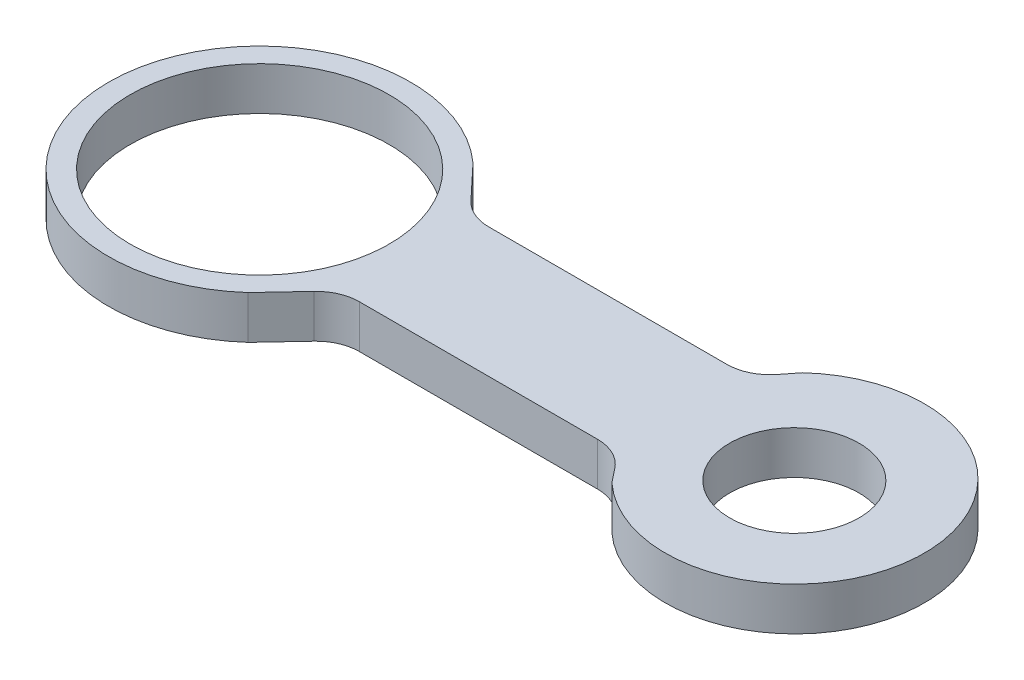
ISO-10303-21;
HEADER;
FILE_DESCRIPTION(('STEP AP214'),'2;1');
FILE_NAME('part.step','',(''),(''),'','','');
FILE_SCHEMA(('AUTOMOTIVE_DESIGN { 1 0 10303 214 1 1 1 1 }'));
ENDSEC;
DATA;
#1=APPLICATION_CONTEXT('core data for automotive mechanical design processes');
#2=APPLICATION_PROTOCOL_DEFINITION('international standard','automotive_design',2000,#1);
#3=PRODUCT_CONTEXT('',#1,'mechanical');
#4=PRODUCT('Part','Part','',(#3));
#5=PRODUCT_RELATED_PRODUCT_CATEGORY('part','',(#4));
#6=PRODUCT_DEFINITION_FORMATION('','',#4);
#7=PRODUCT_DEFINITION_CONTEXT('part definition',#1,'design');
#8=PRODUCT_DEFINITION('design','',#6,#7);
#9=PRODUCT_DEFINITION_SHAPE('','',#8);
#10=(LENGTH_UNIT() NAMED_UNIT(*) SI_UNIT(.MILLI.,.METRE.));
#11=(NAMED_UNIT(*) PLANE_ANGLE_UNIT() SI_UNIT($,.RADIAN.));
#12=(NAMED_UNIT(*) SI_UNIT($,.STERADIAN.) SOLID_ANGLE_UNIT());
#13=UNCERTAINTY_MEASURE_WITH_UNIT(LENGTH_MEASURE(1.E-05),#10,'distance_accuracy_value','');
#14=(GEOMETRIC_REPRESENTATION_CONTEXT(3) GLOBAL_UNCERTAINTY_ASSIGNED_CONTEXT((#13)) GLOBAL_UNIT_ASSIGNED_CONTEXT((#10,
#11,#12)) REPRESENTATION_CONTEXT('',''));
#15=CARTESIAN_POINT('',(0.,0.,0.));
#16=DIRECTION('',(0.,0.,1.));
#17=DIRECTION('',(1.,0.,0.));
#18=AXIS2_PLACEMENT_3D('',#15,#16,#17);
#19=CARTESIAN_POINT('',(34.5542588042572,10.,29.2896186462432));
#20=DIRECTION('',(0.,1.,0.));
#21=DIRECTION('',(0.,0.,1.));
#22=AXIS2_PLACEMENT_3D('',#19,#20,#21);
#23=PLANE('',#22);
#24=CARTESIAN_POINT('',(-58.6855285069248,10.,4.28961864624318));
#25=DIRECTION('',(0.,1.,0.));
#26=DIRECTION('',(0.,0.,1.));
#27=AXIS2_PLACEMENT_3D('',#24,#25,#26);
#28=CIRCLE('',#27,30.);
#29=CARTESIAN_POINT('',(-58.6855285069248,10.,34.2896186462432));
#30=VERTEX_POINT('',#29);
#31=EDGE_CURVE('E313',#30,#30,#28,.T.);
#32=ORIENTED_EDGE('',*,*,#31,.F.);
#33=EDGE_LOOP('',(#32));
#34=FACE_BOUND('',#33,.T.);
#35=CARTESIAN_POINT('',(65.6642007032262,10.,4.77304690580662));
#36=DIRECTION('',(0.,1.,0.));
#37=DIRECTION('',(0.,0.,1.));
#38=AXIS2_PLACEMENT_3D('',#35,#36,#37);
#39=CIRCLE('',#38,15.);
#40=CARTESIAN_POINT('',(65.6642007032262,10.,19.7730469058066));
#41=VERTEX_POINT('',#40);
#42=EDGE_CURVE('E321',#41,#41,#39,.T.);
#43=ORIENTED_EDGE('',*,*,#42,.F.);
#44=EDGE_LOOP('',(#43));
#45=FACE_BOUND('',#44,.T.);
#46=CARTESIAN_POINT('',(34.5542588042572,10.,29.2896186462432));
#47=DIRECTION('',(0.,-1.,0.));
#48=DIRECTION('',(0.,0.,1.));
#49=AXIS2_PLACEMENT_3D('',#46,#47,#48);
#50=CIRCLE('',#49,10.);
#51=CARTESIAN_POINT('',(34.5542588042572,10.,19.2896186462432));
#52=VERTEX_POINT('',#51);
#53=CARTESIAN_POINT('',(42.3953887831997,10.,23.0834378034599));
#54=VERTEX_POINT('',#53);
#55=EDGE_CURVE('E199',#52,#54,#50,.T.);
#56=ORIENTED_EDGE('',*,*,#55,.T.);
#57=DIRECTION('',(0.620618084278327,0.,0.784112997894244));
#58=VECTOR('',#57,1.);
#59=CARTESIAN_POINT('',(42.3953887831997,10.,23.0834378034599));
#60=LINE('',#59,#58);
#61=CARTESIAN_POINT('',(45.0141879093079,10.,26.3921303563741));
#62=VERTEX_POINT('',#61);
#63=EDGE_CURVE('E112',#54,#62,#60,.T.);
#64=ORIENTED_EDGE('',*,*,#63,.T.);
#65=CARTESIAN_POINT('',(65.2991324767334,10.,4.28961864624317));
#66=DIRECTION('',(0.,1.,0.));
#67=DIRECTION('',(0.,0.,1.));
#68=AXIS2_PLACEMENT_3D('',#65,#66,#67);
#69=CIRCLE('',#68,30.);
#70=CARTESIAN_POINT('',(45.0141879093079,10.,-17.8128930638877));
#71=VERTEX_POINT('',#70);
#72=EDGE_CURVE('E236',#62,#71,#69,.T.);
#73=ORIENTED_EDGE('',*,*,#72,.T.);
#74=DIRECTION('',(-0.620618084278327,0.,0.784112997894244));
#75=VECTOR('',#74,1.);
#76=CARTESIAN_POINT('',(42.3953887831997,10.,-14.5042005109736));
#77=LINE('',#76,#75);
#78=CARTESIAN_POINT('',(42.3953887831997,10.,-14.5042005109736));
#79=VERTEX_POINT('',#78);
#80=EDGE_CURVE('E255',#71,#79,#77,.T.);
#81=ORIENTED_EDGE('',*,*,#80,.T.);
#82=CARTESIAN_POINT('',(34.5542588042572,10.,-20.7103813537568));
#83=DIRECTION('',(0.,-1.,0.));
#84=DIRECTION('',(0.,0.,-1.));
#85=AXIS2_PLACEMENT_3D('',#82,#83,#84);
#86=CIRCLE('',#85,10.);
#87=CARTESIAN_POINT('',(34.5542588042572,10.,-10.7103813537568));
#88=VERTEX_POINT('',#87);
#89=EDGE_CURVE('E251',#79,#88,#86,.T.);
#90=ORIENTED_EDGE('',*,*,#89,.T.);
#91=DIRECTION('',(-1.,0.,0.));
#92=VECTOR('',#91,1.);
#93=CARTESIAN_POINT('',(-20.6073835006081,10.,-10.7103813537568));
#94=LINE('',#93,#92);
#95=CARTESIAN_POINT('',(-20.6073835006081,10.,-10.7103813537568));
#96=VERTEX_POINT('',#95);
#97=EDGE_CURVE('E254',#88,#96,#94,.T.);
#98=ORIENTED_EDGE('',*,*,#97,.T.);
#99=CARTESIAN_POINT('',(-20.6073835006081,10.,-20.7103813537568));
#100=DIRECTION('',(0.,-1.,0.));
#101=DIRECTION('',(0.,0.,-1.));
#102=AXIS2_PLACEMENT_3D('',#99,#100,#101);
#103=CIRCLE('',#102,10.);
#104=CARTESIAN_POINT('',(-27.8975448968442,10.,-13.8654162832229));
#105=VERTEX_POINT('',#104);
#106=EDGE_CURVE('E259',#96,#105,#103,.T.);
#107=ORIENTED_EDGE('',*,*,#106,.T.);
#108=DIRECTION('',(-0.684496507053392,0.,-0.729016139623606));
#109=VECTOR('',#108,1.);
#110=CARTESIAN_POINT('',(-27.8975448968442,10.,-13.8654162832229));
#111=LINE('',#110,#109);
#112=CARTESIAN_POINT('',(-35.3103686223505,10.,-21.7603698445526));
#113=VERTEX_POINT('',#112);
#114=EDGE_CURVE('E266',#105,#113,#111,.T.);
#115=ORIENTED_EDGE('',*,*,#114,.T.);
#116=CARTESIAN_POINT('',(-58.6855285069248,10.,4.28961864624318));
#117=DIRECTION('',(0.,1.,0.));
#118=DIRECTION('',(0.,0.,1.));
#119=AXIS2_PLACEMENT_3D('',#116,#117,#118);
#120=CIRCLE('',#119,35.);
#121=CARTESIAN_POINT('',(-35.3103686223505,10.,30.3396071370389));
#122=VERTEX_POINT('',#121);
#123=EDGE_CURVE('E142',#113,#122,#120,.T.);
#124=ORIENTED_EDGE('',*,*,#123,.T.);
#125=DIRECTION('',(0.684496507053393,0.,-0.729016139623605));
#126=VECTOR('',#125,1.);
#127=CARTESIAN_POINT('',(-35.3103686223505,10.,30.3396071370389));
#128=LINE('',#127,#126);
#129=CARTESIAN_POINT('',(-27.8975448968442,10.,22.4446535757092));
#130=VERTEX_POINT('',#129);
#131=EDGE_CURVE('E137',#122,#130,#128,.T.);
#132=ORIENTED_EDGE('',*,*,#131,.T.);
#133=CARTESIAN_POINT('',(-20.6073835006081,10.,29.2896186462432));
#134=DIRECTION('',(0.,-1.,0.));
#135=DIRECTION('',(0.,0.,1.));
#136=AXIS2_PLACEMENT_3D('',#133,#134,#135);
#137=CIRCLE('',#136,10.);
#138=CARTESIAN_POINT('',(-20.6073835006081,10.,19.2896186462432));
#139=VERTEX_POINT('',#138);
#140=EDGE_CURVE('E140',#130,#139,#137,.T.);
#141=ORIENTED_EDGE('',*,*,#140,.T.);
#142=DIRECTION('',(1.,0.,0.));
#143=VECTOR('',#142,1.);
#144=CARTESIAN_POINT('',(-20.6073835006081,10.,19.2896186462432));
#145=LINE('',#144,#143);
#146=EDGE_CURVE('E57',#139,#52,#145,.T.);
#147=ORIENTED_EDGE('',*,*,#146,.T.);
#148=EDGE_LOOP('',(#56,#64,#73,#81,#90,#98,#107,#115,#124,#132,#141,#147));
#149=FACE_BOUND('',#148,.T.);
#150=ADVANCED_FACE('F39',(#34,#45,#149),#23,.T.);
#151=CARTESIAN_POINT('',(34.5542588042572,0.,29.2896186462432));
#152=DIRECTION('',(0.,1.,0.));
#153=DIRECTION('',(0.,0.,1.));
#154=AXIS2_PLACEMENT_3D('',#151,#152,#153);
#155=PLANE('',#154);
#156=CARTESIAN_POINT('',(-58.6855285069248,0.,4.28961864624318));
#157=DIRECTION('',(0.,1.,0.));
#158=DIRECTION('',(0.,0.,1.));
#159=AXIS2_PLACEMENT_3D('',#156,#157,#158);
#160=CIRCLE('',#159,30.);
#161=CARTESIAN_POINT('',(-58.6855285069248,0.,34.2896186462432));
#162=VERTEX_POINT('',#161);
#163=EDGE_CURVE('E169',#162,#162,#160,.T.);
#164=ORIENTED_EDGE('',*,*,#163,.T.);
#165=EDGE_LOOP('',(#164));
#166=FACE_BOUND('',#165,.T.);
#167=CARTESIAN_POINT('',(65.6642007032262,0.,4.77304690580662));
#168=DIRECTION('',(0.,1.,0.));
#169=DIRECTION('',(0.,0.,1.));
#170=AXIS2_PLACEMENT_3D('',#167,#168,#169);
#171=CIRCLE('',#170,15.);
#172=CARTESIAN_POINT('',(65.6642007032262,0.,19.7730469058066));
#173=VERTEX_POINT('',#172);
#174=EDGE_CURVE('E315',#173,#173,#171,.T.);
#175=ORIENTED_EDGE('',*,*,#174,.T.);
#176=EDGE_LOOP('',(#175));
#177=FACE_BOUND('',#176,.T.);
#178=CARTESIAN_POINT('',(34.5542588042572,0.,29.2896186462432));
#179=DIRECTION('',(0.,-1.,0.));
#180=DIRECTION('',(0.,0.,1.));
#181=AXIS2_PLACEMENT_3D('',#178,#179,#180);
#182=CIRCLE('',#181,10.);
#183=CARTESIAN_POINT('',(34.5542588042572,0.,19.2896186462432));
#184=VERTEX_POINT('',#183);
#185=CARTESIAN_POINT('',(42.3953887831997,0.,23.0834378034599));
#186=VERTEX_POINT('',#185);
#187=EDGE_CURVE('E164',#184,#186,#182,.T.);
#188=ORIENTED_EDGE('',*,*,#187,.F.);
#189=DIRECTION('',(1.,0.,0.));
#190=VECTOR('',#189,1.);
#191=CARTESIAN_POINT('',(-20.6073835006081,0.,19.2896186462432));
#192=LINE('',#191,#190);
#193=CARTESIAN_POINT('',(-20.6073835006081,0.,19.2896186462432));
#194=VERTEX_POINT('',#193);
#195=EDGE_CURVE('E104',#194,#184,#192,.T.);
#196=ORIENTED_EDGE('',*,*,#195,.F.);
#197=CARTESIAN_POINT('',(-20.6073835006081,0.,29.2896186462432));
#198=DIRECTION('',(0.,-1.,0.));
#199=DIRECTION('',(0.,0.,1.));
#200=AXIS2_PLACEMENT_3D('',#197,#198,#199);
#201=CIRCLE('',#200,10.);
#202=CARTESIAN_POINT('',(-27.8975448968442,0.,22.4446535757092));
#203=VERTEX_POINT('',#202);
#204=EDGE_CURVE('E98',#203,#194,#201,.T.);
#205=ORIENTED_EDGE('',*,*,#204,.F.);
#206=DIRECTION('',(0.684496507053393,0.,-0.729016139623605));
#207=VECTOR('',#206,1.);
#208=CARTESIAN_POINT('',(-35.3103686223505,0.,30.3396071370389));
#209=LINE('',#208,#207);
#210=CARTESIAN_POINT('',(-35.3103686223505,0.,30.3396071370389));
#211=VERTEX_POINT('',#210);
#212=EDGE_CURVE('E151',#211,#203,#209,.T.);
#213=ORIENTED_EDGE('',*,*,#212,.F.);
#214=CARTESIAN_POINT('',(-58.6855285069248,0.,4.28961864624318));
#215=DIRECTION('',(0.,1.,0.));
#216=DIRECTION('',(0.,0.,1.));
#217=AXIS2_PLACEMENT_3D('',#214,#215,#216);
#218=CIRCLE('',#217,35.);
#219=CARTESIAN_POINT('',(-35.3103686223505,0.,-21.7603698445526));
#220=VERTEX_POINT('',#219);
#221=EDGE_CURVE('E190',#220,#211,#218,.T.);
#222=ORIENTED_EDGE('',*,*,#221,.F.);
#223=DIRECTION('',(-0.684496507053392,0.,-0.729016139623606));
#224=VECTOR('',#223,1.);
#225=CARTESIAN_POINT('',(-27.8975448968442,0.,-13.8654162832229));
#226=LINE('',#225,#224);
#227=CARTESIAN_POINT('',(-27.8975448968442,0.,-13.8654162832229));
#228=VERTEX_POINT('',#227);
#229=EDGE_CURVE('E187',#228,#220,#226,.T.);
#230=ORIENTED_EDGE('',*,*,#229,.F.);
#231=CARTESIAN_POINT('',(-20.6073835006081,0.,-20.7103813537568));
#232=DIRECTION('',(0.,-1.,0.));
#233=DIRECTION('',(0.,0.,-1.));
#234=AXIS2_PLACEMENT_3D('',#231,#232,#233);
#235=CIRCLE('',#234,10.);
#236=CARTESIAN_POINT('',(-20.6073835006081,0.,-10.7103813537568));
#237=VERTEX_POINT('',#236);
#238=EDGE_CURVE('E184',#237,#228,#235,.T.);
#239=ORIENTED_EDGE('',*,*,#238,.F.);
#240=DIRECTION('',(-1.,0.,0.));
#241=VECTOR('',#240,1.);
#242=CARTESIAN_POINT('',(-20.6073835006081,0.,-10.7103813537568));
#243=LINE('',#242,#241);
#244=CARTESIAN_POINT('',(34.5542588042572,0.,-10.7103813537568));
#245=VERTEX_POINT('',#244);
#246=EDGE_CURVE('E181',#245,#237,#243,.T.);
#247=ORIENTED_EDGE('',*,*,#246,.F.);
#248=CARTESIAN_POINT('',(34.5542588042572,0.,-20.7103813537568));
#249=DIRECTION('',(0.,-1.,0.));
#250=DIRECTION('',(0.,0.,-1.));
#251=AXIS2_PLACEMENT_3D('',#248,#249,#250);
#252=CIRCLE('',#251,10.);
#253=CARTESIAN_POINT('',(42.3953887831997,0.,-14.5042005109736));
#254=VERTEX_POINT('',#253);
#255=EDGE_CURVE('E178',#254,#245,#252,.T.);
#256=ORIENTED_EDGE('',*,*,#255,.F.);
#257=DIRECTION('',(-0.620618084278327,0.,0.784112997894244));
#258=VECTOR('',#257,1.);
#259=CARTESIAN_POINT('',(42.3953887831997,0.,-14.5042005109736));
#260=LINE('',#259,#258);
#261=CARTESIAN_POINT('',(45.0141879093079,0.,-17.8128930638877));
#262=VERTEX_POINT('',#261);
#263=EDGE_CURVE('E175',#262,#254,#260,.T.);
#264=ORIENTED_EDGE('',*,*,#263,.F.);
#265=CARTESIAN_POINT('',(65.2991324767334,0.,4.28961864624317));
#266=DIRECTION('',(0.,1.,0.));
#267=DIRECTION('',(0.,0.,1.));
#268=AXIS2_PLACEMENT_3D('',#265,#266,#267);
#269=CIRCLE('',#268,30.);
#270=CARTESIAN_POINT('',(45.0141879093079,0.,26.3921303563741));
#271=VERTEX_POINT('',#270);
#272=EDGE_CURVE('E172',#271,#262,#269,.T.);
#273=ORIENTED_EDGE('',*,*,#272,.F.);
#274=DIRECTION('',(0.620618084278327,0.,0.784112997894244));
#275=VECTOR('',#274,1.);
#276=CARTESIAN_POINT('',(42.3953887831997,0.,23.0834378034599));
#277=LINE('',#276,#275);
#278=EDGE_CURVE('E168',#186,#271,#277,.T.);
#279=ORIENTED_EDGE('',*,*,#278,.F.);
#280=EDGE_LOOP('',(#188,#196,#205,#213,#222,#230,#239,#247,#256,#264,#273,#279));
#281=FACE_BOUND('',#280,.T.);
#282=ADVANCED_FACE('F240',(#166,#177,#281),#155,.F.);
#283=CARTESIAN_POINT('',(34.5542588042572,10.,29.2896186462432));
#284=DIRECTION('',(0.,-1.,0.));
#285=DIRECTION('',(0.,0.,-1.));
#286=AXIS2_PLACEMENT_3D('',#283,#284,#285);
#287=CYLINDRICAL_SURFACE('',#286,10.);
#288=ORIENTED_EDGE('',*,*,#187,.T.);
#289=DIRECTION('',(0.,-1.,0.));
#290=VECTOR('',#289,1.);
#291=CARTESIAN_POINT('',(42.3953887831997,10.,23.0834378034599));
#292=LINE('',#291,#290);
#293=EDGE_CURVE('E11',#54,#186,#292,.T.);
#294=ORIENTED_EDGE('',*,*,#293,.F.);
#295=ORIENTED_EDGE('',*,*,#55,.F.);
#296=DIRECTION('',(0.,-1.,0.));
#297=VECTOR('',#296,1.);
#298=CARTESIAN_POINT('',(34.5542588042572,10.,19.2896186462432));
#299=LINE('',#298,#297);
#300=EDGE_CURVE('E160',#52,#184,#299,.T.);
#301=ORIENTED_EDGE('',*,*,#300,.T.);
#302=EDGE_LOOP('',(#288,#294,#295,#301));
#303=FACE_BOUND('',#302,.T.);
#304=ADVANCED_FACE('F41',(#303),#287,.F.);
#305=CARTESIAN_POINT('',(42.3953887831997,10.,23.0834378034599));
#306=DIRECTION('',(0.784112997894244,0.,-0.620618084278327));
#307=DIRECTION('',(-0.620618084278327,0.,-0.784112997894244));
#308=AXIS2_PLACEMENT_3D('',#305,#306,#307);
#309=PLANE('',#308);
#310=ORIENTED_EDGE('',*,*,#278,.T.);
#311=DIRECTION('',(0.,-1.,0.));
#312=VECTOR('',#311,1.);
#313=CARTESIAN_POINT('',(45.0141879093079,10.,26.3921303563741));
#314=LINE('',#313,#312);
#315=EDGE_CURVE('E49',#62,#271,#314,.T.);
#316=ORIENTED_EDGE('',*,*,#315,.F.);
#317=ORIENTED_EDGE('',*,*,#63,.F.);
#318=ORIENTED_EDGE('',*,*,#293,.T.);
#319=EDGE_LOOP('',(#310,#316,#317,#318));
#320=FACE_BOUND('',#319,.T.);
#321=ADVANCED_FACE('F430',(#320),#309,.F.);
#322=CARTESIAN_POINT('',(65.2991324767334,10.,4.28961864624317));
#323=DIRECTION('',(0.,-1.,0.));
#324=DIRECTION('',(0.,0.,-1.));
#325=AXIS2_PLACEMENT_3D('',#322,#323,#324);
#326=CYLINDRICAL_SURFACE('',#325,30.);
#327=ORIENTED_EDGE('',*,*,#272,.T.);
#328=DIRECTION('',(0.,-1.,0.));
#329=VECTOR('',#328,1.);
#330=CARTESIAN_POINT('',(45.0141879093079,10.,-17.8128930638877));
#331=LINE('',#330,#329);
#332=EDGE_CURVE('E226',#71,#262,#331,.T.);
#333=ORIENTED_EDGE('',*,*,#332,.F.);
#334=ORIENTED_EDGE('',*,*,#72,.F.);
#335=ORIENTED_EDGE('',*,*,#315,.T.);
#336=EDGE_LOOP('',(#327,#333,#334,#335));
#337=FACE_BOUND('',#336,.T.);
#338=ADVANCED_FACE('F234',(#337),#326,.T.);
#339=CARTESIAN_POINT('',(42.3953887831997,10.,-14.5042005109736));
#340=DIRECTION('',(0.784112997894244,0.,0.620618084278327));
#341=DIRECTION('',(0.620618084278327,0.,-0.784112997894244));
#342=AXIS2_PLACEMENT_3D('',#339,#340,#341);
#343=PLANE('',#342);
#344=ORIENTED_EDGE('',*,*,#263,.T.);
#345=DIRECTION('',(0.,-1.,0.));
#346=VECTOR('',#345,1.);
#347=CARTESIAN_POINT('',(42.3953887831997,10.,-14.5042005109736));
#348=LINE('',#347,#346);
#349=EDGE_CURVE('E222',#79,#254,#348,.T.);
#350=ORIENTED_EDGE('',*,*,#349,.F.);
#351=ORIENTED_EDGE('',*,*,#80,.F.);
#352=ORIENTED_EDGE('',*,*,#332,.T.);
#353=EDGE_LOOP('',(#344,#350,#351,#352));
#354=FACE_BOUND('',#353,.T.);
#355=ADVANCED_FACE('F245',(#354),#343,.F.);
#356=CARTESIAN_POINT('',(34.5542588042572,10.,-20.7103813537568));
#357=DIRECTION('',(0.,-1.,0.));
#358=DIRECTION('',(0.,0.,-1.));
#359=AXIS2_PLACEMENT_3D('',#356,#357,#358);
#360=CYLINDRICAL_SURFACE('',#359,10.);
#361=ORIENTED_EDGE('',*,*,#255,.T.);
#362=DIRECTION('',(0.,-1.,0.));
#363=VECTOR('',#362,1.);
#364=CARTESIAN_POINT('',(34.5542588042572,10.,-10.7103813537568));
#365=LINE('',#364,#363);
#366=EDGE_CURVE('E218',#88,#245,#365,.T.);
#367=ORIENTED_EDGE('',*,*,#366,.F.);
#368=ORIENTED_EDGE('',*,*,#89,.F.);
#369=ORIENTED_EDGE('',*,*,#349,.T.);
#370=EDGE_LOOP('',(#361,#367,#368,#369));
#371=FACE_BOUND('',#370,.T.);
#372=ADVANCED_FACE('F249',(#371),#360,.F.);
#373=CARTESIAN_POINT('',(-20.6073835006081,10.,-10.7103813537568));
#374=DIRECTION('',(0.,0.,1.));
#375=DIRECTION('',(1.,0.,0.));
#376=AXIS2_PLACEMENT_3D('',#373,#374,#375);
#377=PLANE('',#376);
#378=ORIENTED_EDGE('',*,*,#246,.T.);
#379=DIRECTION('',(0.,-1.,0.));
#380=VECTOR('',#379,1.);
#381=CARTESIAN_POINT('',(-20.6073835006081,10.,-10.7103813537568));
#382=LINE('',#381,#380);
#383=EDGE_CURVE('E214',#96,#237,#382,.T.);
#384=ORIENTED_EDGE('',*,*,#383,.F.);
#385=ORIENTED_EDGE('',*,*,#97,.F.);
#386=ORIENTED_EDGE('',*,*,#366,.T.);
#387=EDGE_LOOP('',(#378,#384,#385,#386));
#388=FACE_BOUND('',#387,.T.);
#389=ADVANCED_FACE('F395',(#388),#377,.F.);
#390=CARTESIAN_POINT('',(-20.6073835006081,10.,-20.7103813537568));
#391=DIRECTION('',(0.,-1.,0.));
#392=DIRECTION('',(0.,0.,-1.));
#393=AXIS2_PLACEMENT_3D('',#390,#391,#392);
#394=CYLINDRICAL_SURFACE('',#393,10.);
#395=ORIENTED_EDGE('',*,*,#238,.T.);
#396=DIRECTION('',(0.,-1.,0.));
#397=VECTOR('',#396,1.);
#398=CARTESIAN_POINT('',(-27.8975448968442,10.,-13.8654162832229));
#399=LINE('',#398,#397);
#400=EDGE_CURVE('E210',#105,#228,#399,.T.);
#401=ORIENTED_EDGE('',*,*,#400,.F.);
#402=ORIENTED_EDGE('',*,*,#106,.F.);
#403=ORIENTED_EDGE('',*,*,#383,.T.);
#404=EDGE_LOOP('',(#395,#401,#402,#403));
#405=FACE_BOUND('',#404,.T.);
#406=ADVANCED_FACE('F386',(#405),#394,.F.);
#407=CARTESIAN_POINT('',(-27.8975448968442,10.,-13.8654162832229));
#408=DIRECTION('',(-0.729016139623606,0.,0.684496507053392));
#409=DIRECTION('',(0.684496507053392,0.,0.729016139623606));
#410=AXIS2_PLACEMENT_3D('',#407,#408,#409);
#411=PLANE('',#410);
#412=ORIENTED_EDGE('',*,*,#229,.T.);
#413=DIRECTION('',(0.,-1.,0.));
#414=VECTOR('',#413,1.);
#415=CARTESIAN_POINT('',(-35.3103686223505,10.,-21.7603698445526));
#416=LINE('',#415,#414);
#417=EDGE_CURVE('E206',#113,#220,#416,.T.);
#418=ORIENTED_EDGE('',*,*,#417,.F.);
#419=ORIENTED_EDGE('',*,*,#114,.F.);
#420=ORIENTED_EDGE('',*,*,#400,.T.);
#421=EDGE_LOOP('',(#412,#418,#419,#420));
#422=FACE_BOUND('',#421,.T.);
#423=ADVANCED_FACE('F274',(#422),#411,.F.);
#424=CARTESIAN_POINT('',(-58.6855285069248,10.,4.28961864624318));
#425=DIRECTION('',(0.,-1.,0.));
#426=DIRECTION('',(0.,0.,-1.));
#427=AXIS2_PLACEMENT_3D('',#424,#425,#426);
#428=CYLINDRICAL_SURFACE('',#427,35.);
#429=ORIENTED_EDGE('',*,*,#221,.T.);
#430=DIRECTION('',(0.,-1.,0.));
#431=VECTOR('',#430,1.);
#432=CARTESIAN_POINT('',(-35.3103686223505,10.,30.3396071370389));
#433=LINE('',#432,#431);
#434=EDGE_CURVE('E153',#122,#211,#433,.T.);
#435=ORIENTED_EDGE('',*,*,#434,.F.);
#436=ORIENTED_EDGE('',*,*,#123,.F.);
#437=ORIENTED_EDGE('',*,*,#417,.T.);
#438=EDGE_LOOP('',(#429,#435,#436,#437));
#439=FACE_BOUND('',#438,.T.);
#440=ADVANCED_FACE('F278',(#439),#428,.T.);
#441=CARTESIAN_POINT('',(-35.3103686223505,10.,30.3396071370389));
#442=DIRECTION('',(-0.729016139623605,0.,-0.684496507053393));
#443=DIRECTION('',(-0.684496507053393,0.,0.729016139623605));
#444=AXIS2_PLACEMENT_3D('',#441,#442,#443);
#445=PLANE('',#444);
#446=ORIENTED_EDGE('',*,*,#212,.T.);
#447=DIRECTION('',(0.,-1.,0.));
#448=VECTOR('',#447,1.);
#449=CARTESIAN_POINT('',(-27.8975448968442,10.,22.4446535757092));
#450=LINE('',#449,#448);
#451=EDGE_CURVE('E148',#130,#203,#450,.T.);
#452=ORIENTED_EDGE('',*,*,#451,.F.);
#453=ORIENTED_EDGE('',*,*,#131,.F.);
#454=ORIENTED_EDGE('',*,*,#434,.T.);
#455=EDGE_LOOP('',(#446,#452,#453,#454));
#456=FACE_BOUND('',#455,.T.);
#457=ADVANCED_FACE('F149',(#456),#445,.F.);
#458=CARTESIAN_POINT('',(-20.6073835006081,10.,29.2896186462432));
#459=DIRECTION('',(0.,-1.,0.));
#460=DIRECTION('',(0.,0.,-1.));
#461=AXIS2_PLACEMENT_3D('',#458,#459,#460);
#462=CYLINDRICAL_SURFACE('',#461,10.);
#463=ORIENTED_EDGE('',*,*,#204,.T.);
#464=DIRECTION('',(0.,-1.,0.));
#465=VECTOR('',#464,1.);
#466=CARTESIAN_POINT('',(-20.6073835006081,10.,19.2896186462432));
#467=LINE('',#466,#465);
#468=EDGE_CURVE('E154',#139,#194,#467,.T.);
#469=ORIENTED_EDGE('',*,*,#468,.F.);
#470=ORIENTED_EDGE('',*,*,#140,.F.);
#471=ORIENTED_EDGE('',*,*,#451,.T.);
#472=EDGE_LOOP('',(#463,#469,#470,#471));
#473=FACE_BOUND('',#472,.T.);
#474=ADVANCED_FACE('F156',(#473),#462,.F.);
#475=CARTESIAN_POINT('',(-20.6073835006081,10.,19.2896186462432));
#476=DIRECTION('',(0.,0.,-1.));
#477=DIRECTION('',(-1.,0.,0.));
#478=AXIS2_PLACEMENT_3D('',#475,#476,#477);
#479=PLANE('',#478);
#480=ORIENTED_EDGE('',*,*,#195,.T.);
#481=ORIENTED_EDGE('',*,*,#300,.F.);
#482=ORIENTED_EDGE('',*,*,#146,.F.);
#483=ORIENTED_EDGE('',*,*,#468,.T.);
#484=EDGE_LOOP('',(#480,#481,#482,#483));
#485=FACE_BOUND('',#484,.T.);
#486=ADVANCED_FACE('F282',(#485),#479,.F.);
#487=CARTESIAN_POINT('',(65.6642007032262,0.,4.77304690580662));
#488=DIRECTION('',(0.,1.,0.));
#489=DIRECTION('',(0.,0.,1.));
#490=AXIS2_PLACEMENT_3D('',#487,#488,#489);
#491=CYLINDRICAL_SURFACE('',#490,15.);
#492=ORIENTED_EDGE('',*,*,#174,.F.);
#493=EDGE_LOOP('',(#492));
#494=FACE_BOUND('',#493,.T.);
#495=ORIENTED_EDGE('',*,*,#42,.T.);
#496=EDGE_LOOP('',(#495));
#497=FACE_BOUND('',#496,.T.);
#498=ADVANCED_FACE('F284',(#494,#497),#491,.F.);
#499=CARTESIAN_POINT('',(-58.6855285069248,0.,4.28961864624318));
#500=DIRECTION('',(0.,1.,0.));
#501=DIRECTION('',(0.,0.,1.));
#502=AXIS2_PLACEMENT_3D('',#499,#500,#501);
#503=CYLINDRICAL_SURFACE('',#502,30.);
#504=ORIENTED_EDGE('',*,*,#163,.F.);
#505=EDGE_LOOP('',(#504));
#506=FACE_BOUND('',#505,.T.);
#507=ORIENTED_EDGE('',*,*,#31,.T.);
#508=EDGE_LOOP('',(#507));
#509=FACE_BOUND('',#508,.T.);
#510=ADVANCED_FACE('F290',(#506,#509),#503,.F.);
#511=CLOSED_SHELL('',(#150,#282,#304,#321,#338,#355,#372,#389,#406,#423,#440,#457,#474,#486,
#498,#510));
#512=MANIFOLD_SOLID_BREP('B2',#511);
#513=ADVANCED_BREP_SHAPE_REPRESENTATION('',(#18,#512),#14);
#514=SHAPE_DEFINITION_REPRESENTATION(#9,#513);
ENDSEC;
END-ISO-10303-21;
